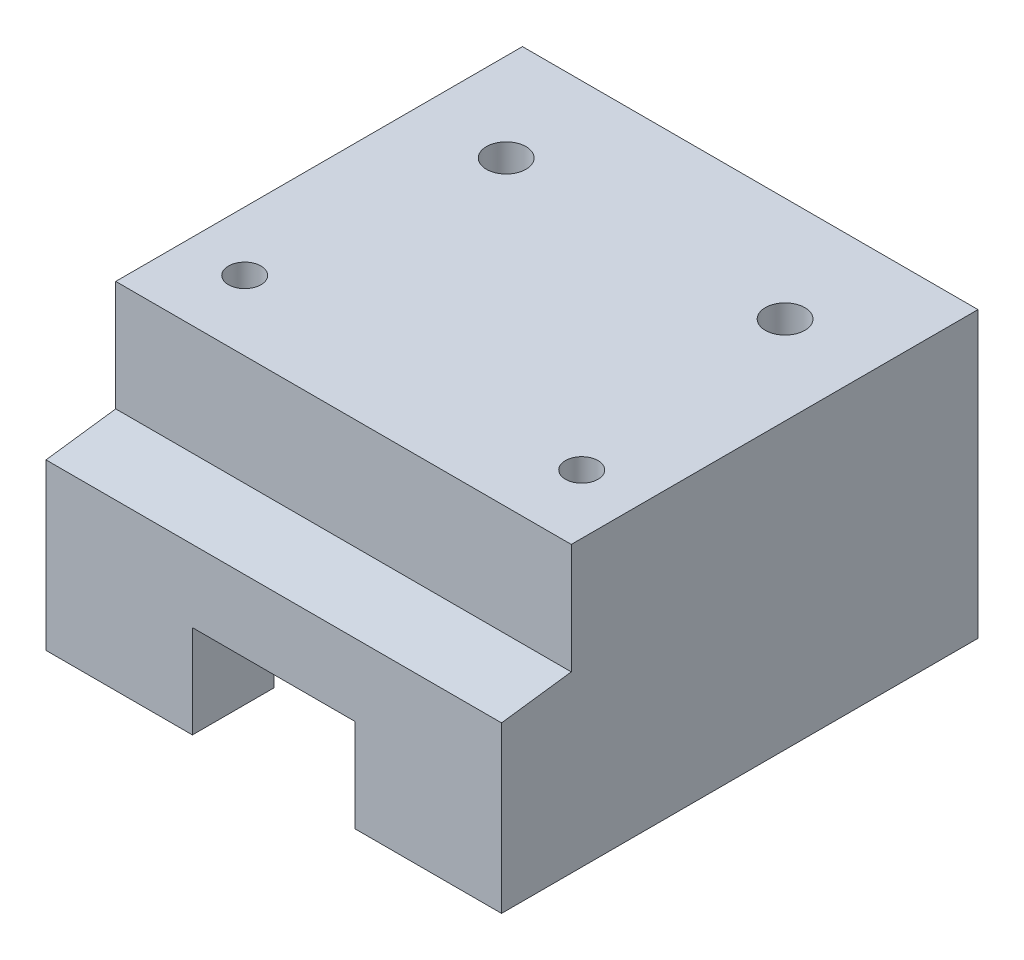
ISO-10303-21;
HEADER;
FILE_DESCRIPTION(('STEP AP214'),'2;1');
FILE_NAME('part.step','',(''),(''),'','','');
FILE_SCHEMA(('AUTOMOTIVE_DESIGN { 1 0 10303 214 1 1 1 1 }'));
ENDSEC;
DATA;
#1=APPLICATION_CONTEXT('core data for automotive mechanical design processes');
#2=APPLICATION_PROTOCOL_DEFINITION('international standard','automotive_design',2000,#1);
#3=PRODUCT_CONTEXT('',#1,'mechanical');
#4=PRODUCT('Part','Part','',(#3));
#5=PRODUCT_RELATED_PRODUCT_CATEGORY('part','',(#4));
#6=PRODUCT_DEFINITION_FORMATION('','',#4);
#7=PRODUCT_DEFINITION_CONTEXT('part definition',#1,'design');
#8=PRODUCT_DEFINITION('design','',#6,#7);
#9=PRODUCT_DEFINITION_SHAPE('','',#8);
#10=(LENGTH_UNIT() NAMED_UNIT(*) SI_UNIT(.MILLI.,.METRE.));
#11=(NAMED_UNIT(*) PLANE_ANGLE_UNIT() SI_UNIT($,.RADIAN.));
#12=(NAMED_UNIT(*) SI_UNIT($,.STERADIAN.) SOLID_ANGLE_UNIT());
#13=UNCERTAINTY_MEASURE_WITH_UNIT(LENGTH_MEASURE(1.E-05),#10,'distance_accuracy_value','');
#14=(GEOMETRIC_REPRESENTATION_CONTEXT(3) GLOBAL_UNCERTAINTY_ASSIGNED_CONTEXT((#13)) GLOBAL_UNIT_ASSIGNED_CONTEXT((#10,
#11,#12)) REPRESENTATION_CONTEXT('',''));
#15=CARTESIAN_POINT('',(0.,0.,0.));
#16=DIRECTION('',(0.,0.,1.));
#17=DIRECTION('',(1.,0.,0.));
#18=AXIS2_PLACEMENT_3D('',#15,#16,#17);
#19=CARTESIAN_POINT('',(0.,3.,0.));
#20=DIRECTION('',(0.,1.,0.));
#21=DIRECTION('',(-1.,0.,0.));
#22=AXIS2_PLACEMENT_3D('',#19,#20,#21);
#23=PLANE('',#22);
#24=DIRECTION('',(0.,0.,-1.));
#25=VECTOR('',#24,1.);
#26=CARTESIAN_POINT('',(-7.,3.,6.));
#27=LINE('',#26,#25);
#28=CARTESIAN_POINT('',(-7.,3.,6.));
#29=VERTEX_POINT('',#28);
#30=CARTESIAN_POINT('',(-7.,3.,-0.999999999999999));
#31=VERTEX_POINT('',#30);
#32=EDGE_CURVE('E306',#29,#31,#27,.T.);
#33=ORIENTED_EDGE('',*,*,#32,.T.);
#34=DIRECTION('',(1.,0.,0.));
#35=VECTOR('',#34,1.);
#36=CARTESIAN_POINT('',(0.,3.,-0.999999999999998));
#37=LINE('',#36,#35);
#38=CARTESIAN_POINT('',(7.,3.,-0.999999999999997));
#39=VERTEX_POINT('',#38);
#40=EDGE_CURVE('E372',#31,#39,#37,.T.);
#41=ORIENTED_EDGE('',*,*,#40,.T.);
#42=DIRECTION('',(0.,0.,1.));
#43=VECTOR('',#42,1.);
#44=CARTESIAN_POINT('',(7.00000000000001,3.,6.));
#45=LINE('',#44,#43);
#46=CARTESIAN_POINT('',(7.00000000000001,3.,6.));
#47=VERTEX_POINT('',#46);
#48=EDGE_CURVE('E317',#39,#47,#45,.T.);
#49=ORIENTED_EDGE('',*,*,#48,.T.);
#50=DIRECTION('',(-1.,0.,0.));
#51=VECTOR('',#50,1.);
#52=CARTESIAN_POINT('',(-7.,3.,6.));
#53=LINE('',#52,#51);
#54=EDGE_CURVE('E303',#47,#29,#53,.T.);
#55=ORIENTED_EDGE('',*,*,#54,.T.);
#56=EDGE_LOOP('',(#33,#41,#49,#55));
#57=FACE_BOUND('',#56,.T.);
#58=ADVANCED_FACE('F35',(#57),#23,.F.);
#59=CARTESIAN_POINT('',(0.,0.,6.));
#60=DIRECTION('',(0.,0.,1.));
#61=DIRECTION('',(1.,0.,0.));
#62=AXIS2_PLACEMENT_3D('',#59,#60,#61);
#63=PLANE('',#62);
#64=DIRECTION('',(0.,1.,0.));
#65=VECTOR('',#64,1.);
#66=CARTESIAN_POINT('',(19.6,-46.0019511730844,6.));
#67=LINE('',#66,#65);
#68=CARTESIAN_POINT('',(19.6,-5.,6.));
#69=VERTEX_POINT('',#68);
#70=CARTESIAN_POINT('',(19.6,9.2,6.));
#71=VERTEX_POINT('',#70);
#72=EDGE_CURVE('E193',#69,#71,#67,.T.);
#73=ORIENTED_EDGE('',*,*,#72,.T.);
#74=DIRECTION('',(-1.,0.,0.));
#75=VECTOR('',#74,1.);
#76=CARTESIAN_POINT('',(-20.,9.2,6.));
#77=LINE('',#76,#75);
#78=CARTESIAN_POINT('',(-19.6,9.2,6.));
#79=VERTEX_POINT('',#78);
#80=EDGE_CURVE('E57',#71,#79,#77,.T.);
#81=ORIENTED_EDGE('',*,*,#80,.T.);
#82=DIRECTION('',(0.,1.,0.));
#83=VECTOR('',#82,1.);
#84=CARTESIAN_POINT('',(-19.6,-46.0019511730844,6.));
#85=LINE('',#84,#83);
#86=CARTESIAN_POINT('',(-19.6,-5.,6.));
#87=VERTEX_POINT('',#86);
#88=EDGE_CURVE('E382',#87,#79,#85,.T.);
#89=ORIENTED_EDGE('',*,*,#88,.F.);
#90=DIRECTION('',(-1.,0.,0.));
#91=VECTOR('',#90,1.);
#92=CARTESIAN_POINT('',(-20.,-5.,6.));
#93=LINE('',#92,#91);
#94=CARTESIAN_POINT('',(-7.,-5.,6.));
#95=VERTEX_POINT('',#94);
#96=EDGE_CURVE('E241',#95,#87,#93,.T.);
#97=ORIENTED_EDGE('',*,*,#96,.F.);
#98=DIRECTION('',(0.,-1.,0.));
#99=VECTOR('',#98,1.);
#100=CARTESIAN_POINT('',(-7.,3.,6.));
#101=LINE('',#100,#99);
#102=EDGE_CURVE('E320',#29,#95,#101,.T.);
#103=ORIENTED_EDGE('',*,*,#102,.F.);
#104=ORIENTED_EDGE('',*,*,#54,.F.);
#105=DIRECTION('',(0.,-1.,0.));
#106=VECTOR('',#105,1.);
#107=CARTESIAN_POINT('',(7.00000000000001,3.,6.));
#108=LINE('',#107,#106);
#109=CARTESIAN_POINT('',(7.00000000000001,-5.,6.));
#110=VERTEX_POINT('',#109);
#111=EDGE_CURVE('E321',#47,#110,#108,.T.);
#112=ORIENTED_EDGE('',*,*,#111,.T.);
#113=EDGE_CURVE('E242',#69,#110,#93,.T.);
#114=ORIENTED_EDGE('',*,*,#113,.F.);
#115=EDGE_LOOP('',(#73,#81,#89,#97,#103,#104,#112,#114));
#116=FACE_BOUND('',#115,.T.);
#117=ADVANCED_FACE('F397',(#116),#63,.T.);
#118=CARTESIAN_POINT('',(0.,0.,0.));
#119=DIRECTION('',(0.,0.,1.));
#120=DIRECTION('',(1.,0.,0.));
#121=AXIS2_PLACEMENT_3D('',#118,#119,#120);
#122=PLANE('',#121);
#123=DIRECTION('',(0.,-1.,0.));
#124=VECTOR('',#123,1.);
#125=CARTESIAN_POINT('',(19.6,0.,0.));
#126=LINE('',#125,#124);
#127=CARTESIAN_POINT('',(19.6,19.5,0.));
#128=VERTEX_POINT('',#127);
#129=CARTESIAN_POINT('',(19.6,10.,0.));
#130=VERTEX_POINT('',#129);
#131=EDGE_CURVE('E49',#128,#130,#126,.T.);
#132=ORIENTED_EDGE('',*,*,#131,.F.);
#133=DIRECTION('',(1.,0.,0.));
#134=VECTOR('',#133,1.);
#135=CARTESIAN_POINT('',(-20.,19.5,0.));
#136=LINE('',#135,#134);
#137=CARTESIAN_POINT('',(-19.6,19.5,0.));
#138=VERTEX_POINT('',#137);
#139=EDGE_CURVE('E203',#138,#128,#136,.T.);
#140=ORIENTED_EDGE('',*,*,#139,.F.);
#141=DIRECTION('',(0.,1.,0.));
#142=VECTOR('',#141,1.);
#143=CARTESIAN_POINT('',(-19.6,0.,0.));
#144=LINE('',#143,#142);
#145=CARTESIAN_POINT('',(-19.6,9.99999999999998,0.));
#146=VERTEX_POINT('',#145);
#147=EDGE_CURVE('E214',#146,#138,#144,.T.);
#148=ORIENTED_EDGE('',*,*,#147,.F.);
#149=DIRECTION('',(-1.,0.,0.));
#150=VECTOR('',#149,1.);
#151=CARTESIAN_POINT('',(20.,10.,0.));
#152=LINE('',#151,#150);
#153=EDGE_CURVE('E324',#130,#146,#152,.T.);
#154=ORIENTED_EDGE('',*,*,#153,.F.);
#155=EDGE_LOOP('',(#132,#140,#148,#154));
#156=FACE_BOUND('',#155,.T.);
#157=ADVANCED_FACE('F386',(#156),#122,.T.);
#158=CARTESIAN_POINT('',(0.,0.,-35.));
#159=DIRECTION('',(0.,0.,1.));
#160=DIRECTION('',(1.,0.,0.));
#161=AXIS2_PLACEMENT_3D('',#158,#159,#160);
#162=PLANE('',#161);
#163=DIRECTION('',(-1.,0.,0.));
#164=VECTOR('',#163,1.);
#165=CARTESIAN_POINT('',(-20.,19.5,-35.));
#166=LINE('',#165,#164);
#167=CARTESIAN_POINT('',(19.6,19.5,-35.));
#168=VERTEX_POINT('',#167);
#169=CARTESIAN_POINT('',(-19.6,19.5,-35.));
#170=VERTEX_POINT('',#169);
#171=EDGE_CURVE('E200',#168,#170,#166,.T.);
#172=ORIENTED_EDGE('',*,*,#171,.F.);
#173=DIRECTION('',(0.,1.,0.));
#174=VECTOR('',#173,1.);
#175=CARTESIAN_POINT('',(19.6,-46.0019511730844,-35.));
#176=LINE('',#175,#174);
#177=CARTESIAN_POINT('',(19.6,-5.,-35.));
#178=VERTEX_POINT('',#177);
#179=EDGE_CURVE('E183',#178,#168,#176,.T.);
#180=ORIENTED_EDGE('',*,*,#179,.F.);
#181=DIRECTION('',(1.,0.,0.));
#182=VECTOR('',#181,1.);
#183=CARTESIAN_POINT('',(-20.,-5.,-35.));
#184=LINE('',#183,#182);
#185=CARTESIAN_POINT('',(4.50000000000001,-5.,-35.));
#186=VERTEX_POINT('',#185);
#187=EDGE_CURVE('E238',#186,#178,#184,.T.);
#188=ORIENTED_EDGE('',*,*,#187,.F.);
#189=DIRECTION('',(0.,-1.,0.));
#190=VECTOR('',#189,1.);
#191=CARTESIAN_POINT('',(4.5,3.,-35.));
#192=LINE('',#191,#190);
#193=CARTESIAN_POINT('',(4.5,3.,-35.));
#194=VERTEX_POINT('',#193);
#195=EDGE_CURVE('E343',#194,#186,#192,.T.);
#196=ORIENTED_EDGE('',*,*,#195,.F.);
#197=DIRECTION('',(1.,0.,0.));
#198=VECTOR('',#197,1.);
#199=CARTESIAN_POINT('',(4.5,3.,-35.));
#200=LINE('',#199,#198);
#201=CARTESIAN_POINT('',(-4.5,3.,-35.));
#202=VERTEX_POINT('',#201);
#203=EDGE_CURVE('E311',#202,#194,#200,.T.);
#204=ORIENTED_EDGE('',*,*,#203,.F.);
#205=DIRECTION('',(0.,-1.,0.));
#206=VECTOR('',#205,1.);
#207=CARTESIAN_POINT('',(-4.5,3.,-35.));
#208=LINE('',#207,#206);
#209=CARTESIAN_POINT('',(-4.49999999999999,-5.,-35.));
#210=VERTEX_POINT('',#209);
#211=EDGE_CURVE('E346',#202,#210,#208,.T.);
#212=ORIENTED_EDGE('',*,*,#211,.T.);
#213=CARTESIAN_POINT('',(-19.6,-5.,-35.));
#214=VERTEX_POINT('',#213);
#215=EDGE_CURVE('E239',#214,#210,#184,.T.);
#216=ORIENTED_EDGE('',*,*,#215,.F.);
#217=DIRECTION('',(0.,1.,0.));
#218=VECTOR('',#217,1.);
#219=CARTESIAN_POINT('',(-19.6,-46.0019511730844,-35.));
#220=LINE('',#219,#218);
#221=EDGE_CURVE('E208',#214,#170,#220,.T.);
#222=ORIENTED_EDGE('',*,*,#221,.T.);
#223=EDGE_LOOP('',(#172,#180,#188,#196,#204,#212,#216,#222));
#224=FACE_BOUND('',#223,.T.);
#225=ADVANCED_FACE('F206',(#224),#162,.F.);
#226=CARTESIAN_POINT('',(7.00000000000001,3.,6.));
#227=DIRECTION('',(1.,0.,0.));
#228=DIRECTION('',(0.,0.,-1.));
#229=AXIS2_PLACEMENT_3D('',#226,#227,#228);
#230=PLANE('',#229);
#231=DIRECTION('',(0.,-1.,0.));
#232=VECTOR('',#231,1.);
#233=CARTESIAN_POINT('',(7.,3.,-0.999999999999997));
#234=LINE('',#233,#232);
#235=CARTESIAN_POINT('',(7.,-5.,-0.999999999999997));
#236=VERTEX_POINT('',#235);
#237=EDGE_CURVE('E325',#39,#236,#234,.T.);
#238=ORIENTED_EDGE('',*,*,#237,.T.);
#239=DIRECTION('',(0.,0.,1.));
#240=VECTOR('',#239,1.);
#241=CARTESIAN_POINT('',(7.00000000000001,-5.,6.));
#242=LINE('',#241,#240);
#243=EDGE_CURVE('E276',#236,#110,#242,.T.);
#244=ORIENTED_EDGE('',*,*,#243,.T.);
#245=ORIENTED_EDGE('',*,*,#111,.F.);
#246=ORIENTED_EDGE('',*,*,#48,.F.);
#247=EDGE_LOOP('',(#238,#244,#245,#246));
#248=FACE_BOUND('',#247,.T.);
#249=ADVANCED_FACE('F475',(#248),#230,.F.);
#250=CARTESIAN_POINT('',(7.,3.,-0.999999999999997));
#251=DIRECTION('',(0.,0.,1.));
#252=DIRECTION('',(1.,0.,0.));
#253=AXIS2_PLACEMENT_3D('',#250,#251,#252);
#254=PLANE('',#253);
#255=DIRECTION('',(0.,-1.,0.));
#256=VECTOR('',#255,1.);
#257=CARTESIAN_POINT('',(9.,3.,-0.999999999999997));
#258=LINE('',#257,#256);
#259=CARTESIAN_POINT('',(9.,5.,-0.999999999999997));
#260=VERTEX_POINT('',#259);
#261=CARTESIAN_POINT('',(9.,-5.,-0.999999999999997));
#262=VERTEX_POINT('',#261);
#263=EDGE_CURVE('E328',#260,#262,#258,.T.);
#264=ORIENTED_EDGE('',*,*,#263,.T.);
#265=DIRECTION('',(-1.,0.,0.));
#266=VECTOR('',#265,1.);
#267=CARTESIAN_POINT('',(7.,-5.,-0.999999999999997));
#268=LINE('',#267,#266);
#269=EDGE_CURVE('E248',#262,#236,#268,.T.);
#270=ORIENTED_EDGE('',*,*,#269,.T.);
#271=ORIENTED_EDGE('',*,*,#237,.F.);
#272=ORIENTED_EDGE('',*,*,#40,.F.);
#273=DIRECTION('',(0.,-1.,0.));
#274=VECTOR('',#273,1.);
#275=CARTESIAN_POINT('',(-7.,3.,-0.999999999999999));
#276=LINE('',#275,#274);
#277=CARTESIAN_POINT('',(-7.,-5.,-0.999999999999999));
#278=VERTEX_POINT('',#277);
#279=EDGE_CURVE('E364',#31,#278,#276,.T.);
#280=ORIENTED_EDGE('',*,*,#279,.T.);
#281=CARTESIAN_POINT('',(-9.,-5.,-0.999999999999999));
#282=VERTEX_POINT('',#281);
#283=EDGE_CURVE('E244',#278,#282,#268,.T.);
#284=ORIENTED_EDGE('',*,*,#283,.T.);
#285=DIRECTION('',(0.,-1.,0.));
#286=VECTOR('',#285,1.);
#287=CARTESIAN_POINT('',(-9.,3.,-0.999999999999999));
#288=LINE('',#287,#286);
#289=CARTESIAN_POINT('',(-9.,5.,-0.999999999999999));
#290=VERTEX_POINT('',#289);
#291=EDGE_CURVE('E361',#290,#282,#288,.T.);
#292=ORIENTED_EDGE('',*,*,#291,.F.);
#293=DIRECTION('',(-1.,0.,0.));
#294=VECTOR('',#293,1.);
#295=CARTESIAN_POINT('',(-9.,5.,-0.999999999999999));
#296=LINE('',#295,#294);
#297=EDGE_CURVE('E300',#260,#290,#296,.T.);
#298=ORIENTED_EDGE('',*,*,#297,.F.);
#299=EDGE_LOOP('',(#264,#270,#271,#272,#280,#284,#292,#298));
#300=FACE_BOUND('',#299,.T.);
#301=ADVANCED_FACE('F465',(#300),#254,.F.);
#302=CARTESIAN_POINT('',(9.,3.,-0.999999999999997));
#303=DIRECTION('',(1.,0.,0.));
#304=DIRECTION('',(0.,1.,0.));
#305=AXIS2_PLACEMENT_3D('',#302,#303,#304);
#306=PLANE('',#305);
#307=DIRECTION('',(0.,-1.,0.));
#308=VECTOR('',#307,1.);
#309=CARTESIAN_POINT('',(9.,3.,-23.));
#310=LINE('',#309,#308);
#311=CARTESIAN_POINT('',(9.,5.,-23.));
#312=VERTEX_POINT('',#311);
#313=CARTESIAN_POINT('',(9.00000000000001,-5.,-23.));
#314=VERTEX_POINT('',#313);
#315=EDGE_CURVE('E331',#312,#314,#310,.T.);
#316=ORIENTED_EDGE('',*,*,#315,.T.);
#317=DIRECTION('',(0.,0.,1.));
#318=VECTOR('',#317,1.);
#319=CARTESIAN_POINT('',(9.,-5.,-0.999999999999997));
#320=LINE('',#319,#318);
#321=EDGE_CURVE('E273',#314,#262,#320,.T.);
#322=ORIENTED_EDGE('',*,*,#321,.T.);
#323=ORIENTED_EDGE('',*,*,#263,.F.);
#324=DIRECTION('',(0.,0.,1.));
#325=VECTOR('',#324,1.);
#326=CARTESIAN_POINT('',(9.,5.,-0.999999999999997));
#327=LINE('',#326,#325);
#328=EDGE_CURVE('E297',#312,#260,#327,.T.);
#329=ORIENTED_EDGE('',*,*,#328,.F.);
#330=EDGE_LOOP('',(#316,#322,#323,#329));
#331=FACE_BOUND('',#330,.T.);
#332=ADVANCED_FACE('F478',(#331),#306,.F.);
#333=CARTESIAN_POINT('',(9.,3.,-23.));
#334=DIRECTION('',(0.768221279597377,0.,-0.640184399664479));
#335=DIRECTION('',(-0.640184399664479,0.,-0.768221279597377));
#336=AXIS2_PLACEMENT_3D('',#333,#334,#335);
#337=PLANE('',#336);
#338=DIRECTION('',(0.,-1.,0.));
#339=VECTOR('',#338,1.);
#340=CARTESIAN_POINT('',(6.5,3.,-26.));
#341=LINE('',#340,#339);
#342=CARTESIAN_POINT('',(6.5,5.,-26.));
#343=VERTEX_POINT('',#342);
#344=CARTESIAN_POINT('',(6.50000000000001,-5.,-26.));
#345=VERTEX_POINT('',#344);
#346=EDGE_CURVE('E334',#343,#345,#341,.T.);
#347=ORIENTED_EDGE('',*,*,#346,.T.);
#348=DIRECTION('',(0.640184399664479,0.,0.768221279597377));
#349=VECTOR('',#348,1.);
#350=CARTESIAN_POINT('',(9.,-5.,-23.));
#351=LINE('',#350,#349);
#352=EDGE_CURVE('E270',#345,#314,#351,.T.);
#353=ORIENTED_EDGE('',*,*,#352,.T.);
#354=ORIENTED_EDGE('',*,*,#315,.F.);
#355=DIRECTION('',(0.640184399664479,0.,0.768221279597377));
#356=VECTOR('',#355,1.);
#357=CARTESIAN_POINT('',(9.,5.,-23.));
#358=LINE('',#357,#356);
#359=EDGE_CURVE('E294',#343,#312,#358,.T.);
#360=ORIENTED_EDGE('',*,*,#359,.F.);
#361=EDGE_LOOP('',(#347,#353,#354,#360));
#362=FACE_BOUND('',#361,.T.);
#363=ADVANCED_FACE('F451',(#362),#337,.F.);
#364=CARTESIAN_POINT('',(6.5,3.,-26.));
#365=DIRECTION('',(1.,0.,0.));
#366=DIRECTION('',(0.,1.,0.));
#367=AXIS2_PLACEMENT_3D('',#364,#365,#366);
#368=PLANE('',#367);
#369=DIRECTION('',(0.,-1.,0.));
#370=VECTOR('',#369,1.);
#371=CARTESIAN_POINT('',(6.5,3.,-33.));
#372=LINE('',#371,#370);
#373=CARTESIAN_POINT('',(6.5,5.,-33.));
#374=VERTEX_POINT('',#373);
#375=CARTESIAN_POINT('',(6.50000000000001,-5.,-33.));
#376=VERTEX_POINT('',#375);
#377=EDGE_CURVE('E337',#374,#376,#372,.T.);
#378=ORIENTED_EDGE('',*,*,#377,.T.);
#379=DIRECTION('',(0.,0.,1.));
#380=VECTOR('',#379,1.);
#381=CARTESIAN_POINT('',(6.50000000000001,-5.,-26.));
#382=LINE('',#381,#380);
#383=EDGE_CURVE('E267',#376,#345,#382,.T.);
#384=ORIENTED_EDGE('',*,*,#383,.T.);
#385=ORIENTED_EDGE('',*,*,#346,.F.);
#386=DIRECTION('',(0.,0.,1.));
#387=VECTOR('',#386,1.);
#388=CARTESIAN_POINT('',(6.5,5.,-26.));
#389=LINE('',#388,#387);
#390=EDGE_CURVE('E291',#374,#343,#389,.T.);
#391=ORIENTED_EDGE('',*,*,#390,.F.);
#392=EDGE_LOOP('',(#378,#384,#385,#391));
#393=FACE_BOUND('',#392,.T.);
#394=ADVANCED_FACE('F447',(#393),#368,.F.);
#395=CARTESIAN_POINT('',(6.5,3.,-33.));
#396=DIRECTION('',(0.,0.,-1.));
#397=DIRECTION('',(-1.,0.,0.));
#398=AXIS2_PLACEMENT_3D('',#395,#396,#397);
#399=PLANE('',#398);
#400=DIRECTION('',(0.,-1.,0.));
#401=VECTOR('',#400,1.);
#402=CARTESIAN_POINT('',(-6.5,3.,-33.));
#403=LINE('',#402,#401);
#404=CARTESIAN_POINT('',(-6.5,5.,-33.));
#405=VERTEX_POINT('',#404);
#406=CARTESIAN_POINT('',(-6.49999999999999,-5.,-33.));
#407=VERTEX_POINT('',#406);
#408=EDGE_CURVE('E352',#405,#407,#403,.T.);
#409=ORIENTED_EDGE('',*,*,#408,.T.);
#410=DIRECTION('',(1.,0.,0.));
#411=VECTOR('',#410,1.);
#412=CARTESIAN_POINT('',(6.50000000000001,-5.,-33.));
#413=LINE('',#412,#411);
#414=CARTESIAN_POINT('',(-4.5,-5.,-33.));
#415=VERTEX_POINT('',#414);
#416=EDGE_CURVE('E257',#407,#415,#413,.T.);
#417=ORIENTED_EDGE('',*,*,#416,.T.);
#418=DIRECTION('',(0.,-1.,0.));
#419=VECTOR('',#418,1.);
#420=CARTESIAN_POINT('',(-4.5,3.,-33.));
#421=LINE('',#420,#419);
#422=CARTESIAN_POINT('',(-4.49999999999999,3.,-33.));
#423=VERTEX_POINT('',#422);
#424=EDGE_CURVE('E349',#423,#415,#421,.T.);
#425=ORIENTED_EDGE('',*,*,#424,.F.);
#426=DIRECTION('',(-1.,0.,0.));
#427=VECTOR('',#426,1.);
#428=CARTESIAN_POINT('',(0.,3.,-33.));
#429=LINE('',#428,#427);
#430=CARTESIAN_POINT('',(4.50000000000001,3.,-33.));
#431=VERTEX_POINT('',#430);
#432=EDGE_CURVE('E370',#431,#423,#429,.T.);
#433=ORIENTED_EDGE('',*,*,#432,.F.);
#434=DIRECTION('',(0.,-1.,0.));
#435=VECTOR('',#434,1.);
#436=CARTESIAN_POINT('',(4.5,3.,-33.));
#437=LINE('',#436,#435);
#438=CARTESIAN_POINT('',(4.50000000000001,-5.,-33.));
#439=VERTEX_POINT('',#438);
#440=EDGE_CURVE('E340',#431,#439,#437,.T.);
#441=ORIENTED_EDGE('',*,*,#440,.T.);
#442=EDGE_CURVE('E261',#439,#376,#413,.T.);
#443=ORIENTED_EDGE('',*,*,#442,.T.);
#444=ORIENTED_EDGE('',*,*,#377,.F.);
#445=DIRECTION('',(1.,0.,0.));
#446=VECTOR('',#445,1.);
#447=CARTESIAN_POINT('',(6.5,5.,-33.));
#448=LINE('',#447,#446);
#449=EDGE_CURVE('E288',#405,#374,#448,.T.);
#450=ORIENTED_EDGE('',*,*,#449,.F.);
#451=EDGE_LOOP('',(#409,#417,#425,#433,#441,#443,#444,#450));
#452=FACE_BOUND('',#451,.T.);
#453=ADVANCED_FACE('F439',(#452),#399,.F.);
#454=CARTESIAN_POINT('',(4.5,3.,-33.));
#455=DIRECTION('',(1.,0.,0.));
#456=DIRECTION('',(0.,1.,0.));
#457=AXIS2_PLACEMENT_3D('',#454,#455,#456);
#458=PLANE('',#457);
#459=ORIENTED_EDGE('',*,*,#195,.T.);
#460=DIRECTION('',(0.,0.,1.));
#461=VECTOR('',#460,1.);
#462=CARTESIAN_POINT('',(4.50000000000001,-5.,-33.));
#463=LINE('',#462,#461);
#464=EDGE_CURVE('E264',#186,#439,#463,.T.);
#465=ORIENTED_EDGE('',*,*,#464,.T.);
#466=ORIENTED_EDGE('',*,*,#440,.F.);
#467=DIRECTION('',(0.,0.,1.));
#468=VECTOR('',#467,1.);
#469=CARTESIAN_POINT('',(4.5,3.,-33.));
#470=LINE('',#469,#468);
#471=EDGE_CURVE('E314',#194,#431,#470,.T.);
#472=ORIENTED_EDGE('',*,*,#471,.F.);
#473=EDGE_LOOP('',(#459,#465,#466,#472));
#474=FACE_BOUND('',#473,.T.);
#475=ADVANCED_FACE('F436',(#474),#458,.F.);
#476=CARTESIAN_POINT('',(-4.5,3.,-33.));
#477=DIRECTION('',(-1.,0.,0.));
#478=DIRECTION('',(0.,-1.,0.));
#479=AXIS2_PLACEMENT_3D('',#476,#477,#478);
#480=PLANE('',#479);
#481=ORIENTED_EDGE('',*,*,#424,.T.);
#482=DIRECTION('',(0.,0.,-1.));
#483=VECTOR('',#482,1.);
#484=CARTESIAN_POINT('',(-4.49999999999999,-5.,-33.));
#485=LINE('',#484,#483);
#486=EDGE_CURVE('E260',#415,#210,#485,.T.);
#487=ORIENTED_EDGE('',*,*,#486,.T.);
#488=ORIENTED_EDGE('',*,*,#211,.F.);
#489=DIRECTION('',(0.,0.,-1.));
#490=VECTOR('',#489,1.);
#491=CARTESIAN_POINT('',(-4.5,3.,-33.));
#492=LINE('',#491,#490);
#493=EDGE_CURVE('E309',#423,#202,#492,.T.);
#494=ORIENTED_EDGE('',*,*,#493,.F.);
#495=EDGE_LOOP('',(#481,#487,#488,#494));
#496=FACE_BOUND('',#495,.T.);
#497=ADVANCED_FACE('F443',(#496),#480,.F.);
#498=CARTESIAN_POINT('',(-6.5,3.,-26.));
#499=DIRECTION('',(-1.,0.,0.));
#500=DIRECTION('',(0.,-1.,0.));
#501=AXIS2_PLACEMENT_3D('',#498,#499,#500);
#502=PLANE('',#501);
#503=DIRECTION('',(0.,-1.,0.));
#504=VECTOR('',#503,1.);
#505=CARTESIAN_POINT('',(-6.5,3.,-26.));
#506=LINE('',#505,#504);
#507=CARTESIAN_POINT('',(-6.5,5.,-26.));
#508=VERTEX_POINT('',#507);
#509=CARTESIAN_POINT('',(-6.49999999999999,-5.,-26.));
#510=VERTEX_POINT('',#509);
#511=EDGE_CURVE('E355',#508,#510,#506,.T.);
#512=ORIENTED_EDGE('',*,*,#511,.T.);
#513=DIRECTION('',(0.,0.,-1.));
#514=VECTOR('',#513,1.);
#515=CARTESIAN_POINT('',(-6.49999999999999,-5.,-26.));
#516=LINE('',#515,#514);
#517=EDGE_CURVE('E254',#510,#407,#516,.T.);
#518=ORIENTED_EDGE('',*,*,#517,.T.);
#519=ORIENTED_EDGE('',*,*,#408,.F.);
#520=DIRECTION('',(0.,0.,-1.));
#521=VECTOR('',#520,1.);
#522=CARTESIAN_POINT('',(-6.5,5.,-33.));
#523=LINE('',#522,#521);
#524=EDGE_CURVE('E285',#508,#405,#523,.T.);
#525=ORIENTED_EDGE('',*,*,#524,.F.);
#526=EDGE_LOOP('',(#512,#518,#519,#525));
#527=FACE_BOUND('',#526,.T.);
#528=ADVANCED_FACE('F456',(#527),#502,.F.);
#529=CARTESIAN_POINT('',(-8.99999999999999,3.,-23.));
#530=DIRECTION('',(-0.768221279597376,0.,-0.640184399664479));
#531=DIRECTION('',(-0.640184399664479,0.,0.768221279597376));
#532=AXIS2_PLACEMENT_3D('',#529,#530,#531);
#533=PLANE('',#532);
#534=DIRECTION('',(0.,-1.,0.));
#535=VECTOR('',#534,1.);
#536=CARTESIAN_POINT('',(-8.99999999999999,3.,-23.));
#537=LINE('',#536,#535);
#538=CARTESIAN_POINT('',(-8.99999999999999,5.,-23.));
#539=VERTEX_POINT('',#538);
#540=CARTESIAN_POINT('',(-8.99999999999999,-5.,-23.));
#541=VERTEX_POINT('',#540);
#542=EDGE_CURVE('E358',#539,#541,#537,.T.);
#543=ORIENTED_EDGE('',*,*,#542,.T.);
#544=DIRECTION('',(0.640184399664479,0.,-0.768221279597376));
#545=VECTOR('',#544,1.);
#546=CARTESIAN_POINT('',(-8.99999999999999,-5.,-23.));
#547=LINE('',#546,#545);
#548=EDGE_CURVE('E251',#541,#510,#547,.T.);
#549=ORIENTED_EDGE('',*,*,#548,.T.);
#550=ORIENTED_EDGE('',*,*,#511,.F.);
#551=DIRECTION('',(0.640184399664479,0.,-0.768221279597377));
#552=VECTOR('',#551,1.);
#553=CARTESIAN_POINT('',(-6.5,5.,-26.));
#554=LINE('',#553,#552);
#555=EDGE_CURVE('E282',#539,#508,#554,.T.);
#556=ORIENTED_EDGE('',*,*,#555,.F.);
#557=EDGE_LOOP('',(#543,#549,#550,#556));
#558=FACE_BOUND('',#557,.T.);
#559=ADVANCED_FACE('F460',(#558),#533,.F.);
#560=CARTESIAN_POINT('',(-9.,3.,-0.999999999999999));
#561=DIRECTION('',(-1.,0.,0.));
#562=DIRECTION('',(0.,0.,1.));
#563=AXIS2_PLACEMENT_3D('',#560,#561,#562);
#564=PLANE('',#563);
#565=ORIENTED_EDGE('',*,*,#291,.T.);
#566=DIRECTION('',(0.,0.,-1.));
#567=VECTOR('',#566,1.);
#568=CARTESIAN_POINT('',(-9.,-5.,-0.999999999999999));
#569=LINE('',#568,#567);
#570=EDGE_CURVE('E247',#282,#541,#569,.T.);
#571=ORIENTED_EDGE('',*,*,#570,.T.);
#572=ORIENTED_EDGE('',*,*,#542,.F.);
#573=DIRECTION('',(0.,0.,-1.));
#574=VECTOR('',#573,1.);
#575=CARTESIAN_POINT('',(-8.99999999999999,5.,-23.));
#576=LINE('',#575,#574);
#577=EDGE_CURVE('E279',#290,#539,#576,.T.);
#578=ORIENTED_EDGE('',*,*,#577,.F.);
#579=EDGE_LOOP('',(#565,#571,#572,#578));
#580=FACE_BOUND('',#579,.T.);
#581=ADVANCED_FACE('F428',(#580),#564,.F.);
#582=CARTESIAN_POINT('',(-7.,3.,6.));
#583=DIRECTION('',(-1.,0.,0.));
#584=DIRECTION('',(0.,-1.,0.));
#585=AXIS2_PLACEMENT_3D('',#582,#583,#584);
#586=PLANE('',#585);
#587=ORIENTED_EDGE('',*,*,#102,.T.);
#588=DIRECTION('',(0.,0.,-1.));
#589=VECTOR('',#588,1.);
#590=CARTESIAN_POINT('',(-7.,-5.,6.));
#591=LINE('',#590,#589);
#592=EDGE_CURVE('E374',#95,#278,#591,.T.);
#593=ORIENTED_EDGE('',*,*,#592,.T.);
#594=ORIENTED_EDGE('',*,*,#279,.F.);
#595=ORIENTED_EDGE('',*,*,#32,.F.);
#596=EDGE_LOOP('',(#587,#593,#594,#595));
#597=FACE_BOUND('',#596,.T.);
#598=ADVANCED_FACE('F420',(#597),#586,.F.);
#599=ORIENTED_EDGE('',*,*,#471,.T.);
#600=ORIENTED_EDGE('',*,*,#432,.T.);
#601=ORIENTED_EDGE('',*,*,#493,.T.);
#602=ORIENTED_EDGE('',*,*,#203,.T.);
#603=EDGE_LOOP('',(#599,#600,#601,#602));
#604=FACE_BOUND('',#603,.T.);
#605=ADVANCED_FACE('F411',(#604),#23,.F.);
#606=CARTESIAN_POINT('',(0.,5.,0.));
#607=DIRECTION('',(0.,1.,0.));
#608=DIRECTION('',(-1.,0.,0.));
#609=AXIS2_PLACEMENT_3D('',#606,#607,#608);
#610=PLANE('',#609);
#611=ORIENTED_EDGE('',*,*,#577,.T.);
#612=ORIENTED_EDGE('',*,*,#555,.T.);
#613=ORIENTED_EDGE('',*,*,#524,.T.);
#614=ORIENTED_EDGE('',*,*,#449,.T.);
#615=ORIENTED_EDGE('',*,*,#390,.T.);
#616=ORIENTED_EDGE('',*,*,#359,.T.);
#617=ORIENTED_EDGE('',*,*,#328,.T.);
#618=ORIENTED_EDGE('',*,*,#297,.T.);
#619=EDGE_LOOP('',(#611,#612,#613,#614,#615,#616,#617,#618));
#620=FACE_BOUND('',#619,.T.);
#621=ADVANCED_FACE('F419',(#620),#610,.F.);
#622=CARTESIAN_POINT('',(0.,-5.,0.));
#623=DIRECTION('',(0.,1.,0.));
#624=DIRECTION('',(-1.,0.,0.));
#625=AXIS2_PLACEMENT_3D('',#622,#623,#624);
#626=PLANE('',#625);
#627=CARTESIAN_POINT('',(-12.,-5.,-26.));
#628=DIRECTION('',(0.,-1.,0.));
#629=DIRECTION('',(-1.,0.,0.));
#630=AXIS2_PLACEMENT_3D('',#627,#628,#629);
#631=CIRCLE('',#630,1.7);
#632=CARTESIAN_POINT('',(-13.7,-5.,-26.));
#633=VERTEX_POINT('',#632);
#634=EDGE_CURVE('E231',#633,#633,#631,.T.);
#635=ORIENTED_EDGE('',*,*,#634,.F.);
#636=EDGE_LOOP('',(#635));
#637=FACE_BOUND('',#636,.T.);
#638=CARTESIAN_POINT('',(-14.5,-5.,-6.));
#639=DIRECTION('',(0.,-1.,0.));
#640=DIRECTION('',(-1.,0.,0.));
#641=AXIS2_PLACEMENT_3D('',#638,#639,#640);
#642=CIRCLE('',#641,1.4);
#643=CARTESIAN_POINT('',(-15.9,-5.,-6.));
#644=VERTEX_POINT('',#643);
#645=EDGE_CURVE('E226',#644,#644,#642,.T.);
#646=ORIENTED_EDGE('',*,*,#645,.F.);
#647=EDGE_LOOP('',(#646));
#648=FACE_BOUND('',#647,.T.);
#649=ORIENTED_EDGE('',*,*,#96,.T.);
#650=DIRECTION('',(0.,0.,1.));
#651=VECTOR('',#650,1.);
#652=CARTESIAN_POINT('',(-19.6,-5.,-35.));
#653=LINE('',#652,#651);
#654=EDGE_CURVE('E387',#214,#87,#653,.T.);
#655=ORIENTED_EDGE('',*,*,#654,.F.);
#656=ORIENTED_EDGE('',*,*,#215,.T.);
#657=ORIENTED_EDGE('',*,*,#486,.F.);
#658=ORIENTED_EDGE('',*,*,#416,.F.);
#659=ORIENTED_EDGE('',*,*,#517,.F.);
#660=ORIENTED_EDGE('',*,*,#548,.F.);
#661=ORIENTED_EDGE('',*,*,#570,.F.);
#662=ORIENTED_EDGE('',*,*,#283,.F.);
#663=ORIENTED_EDGE('',*,*,#592,.F.);
#664=EDGE_LOOP('',(#649,#655,#656,#657,#658,#659,#660,#661,#662,#663));
#665=FACE_BOUND('',#664,.T.);
#666=ADVANCED_FACE('F426',(#637,#648,#665),#626,.F.);
#667=CARTESIAN_POINT('',(14.5,-5.,-6.));
#668=DIRECTION('',(0.,-1.,0.));
#669=DIRECTION('',(1.,0.,0.));
#670=AXIS2_PLACEMENT_3D('',#667,#668,#669);
#671=CIRCLE('',#670,1.4);
#672=CARTESIAN_POINT('',(15.9,-5.,-6.));
#673=VERTEX_POINT('',#672);
#674=EDGE_CURVE('E227',#673,#673,#671,.T.);
#675=ORIENTED_EDGE('',*,*,#674,.F.);
#676=EDGE_LOOP('',(#675));
#677=FACE_BOUND('',#676,.T.);
#678=CARTESIAN_POINT('',(12.,-5.,-26.));
#679=DIRECTION('',(0.,-1.,0.));
#680=DIRECTION('',(1.,0.,0.));
#681=AXIS2_PLACEMENT_3D('',#678,#679,#680);
#682=CIRCLE('',#681,1.7);
#683=CARTESIAN_POINT('',(13.7,-5.,-26.));
#684=VERTEX_POINT('',#683);
#685=EDGE_CURVE('E230',#684,#684,#682,.T.);
#686=ORIENTED_EDGE('',*,*,#685,.F.);
#687=EDGE_LOOP('',(#686));
#688=FACE_BOUND('',#687,.T.);
#689=ORIENTED_EDGE('',*,*,#187,.T.);
#690=DIRECTION('',(0.,0.,-1.));
#691=VECTOR('',#690,1.);
#692=CARTESIAN_POINT('',(19.6,-5.,-35.));
#693=LINE('',#692,#691);
#694=EDGE_CURVE('E188',#69,#178,#693,.T.);
#695=ORIENTED_EDGE('',*,*,#694,.F.);
#696=ORIENTED_EDGE('',*,*,#113,.T.);
#697=ORIENTED_EDGE('',*,*,#243,.F.);
#698=ORIENTED_EDGE('',*,*,#269,.F.);
#699=ORIENTED_EDGE('',*,*,#321,.F.);
#700=ORIENTED_EDGE('',*,*,#352,.F.);
#701=ORIENTED_EDGE('',*,*,#383,.F.);
#702=ORIENTED_EDGE('',*,*,#442,.F.);
#703=ORIENTED_EDGE('',*,*,#464,.F.);
#704=EDGE_LOOP('',(#689,#695,#696,#697,#698,#699,#700,#701,#702,#703));
#705=FACE_BOUND('',#704,.T.);
#706=ADVANCED_FACE('F445',(#677,#688,#705),#626,.F.);
#707=CARTESIAN_POINT('',(12.,22.5,-26.));
#708=DIRECTION('',(0.,-1.,0.));
#709=DIRECTION('',(1.,0.,0.));
#710=AXIS2_PLACEMENT_3D('',#707,#708,#709);
#711=CYLINDRICAL_SURFACE('',#710,1.7);
#712=CARTESIAN_POINT('',(12.,19.5,-26.));
#713=DIRECTION('',(0.,-1.,0.));
#714=DIRECTION('',(0.,0.,-1.));
#715=AXIS2_PLACEMENT_3D('',#712,#713,#714);
#716=CIRCLE('',#715,1.7);
#717=CARTESIAN_POINT('',(12.,19.5,-27.7));
#718=VERTEX_POINT('',#717);
#719=EDGE_CURVE('E223',#718,#718,#716,.F.);
#720=ORIENTED_EDGE('',*,*,#719,.T.);
#721=EDGE_LOOP('',(#720));
#722=FACE_BOUND('',#721,.T.);
#723=ORIENTED_EDGE('',*,*,#685,.T.);
#724=EDGE_LOOP('',(#723));
#725=FACE_BOUND('',#724,.T.);
#726=ADVANCED_FACE('F526',(#722,#725),#711,.F.);
#727=CARTESIAN_POINT('',(14.5,22.5,-6.));
#728=DIRECTION('',(0.,-1.,0.));
#729=DIRECTION('',(1.,0.,0.));
#730=AXIS2_PLACEMENT_3D('',#727,#728,#729);
#731=CYLINDRICAL_SURFACE('',#730,1.4);
#732=CARTESIAN_POINT('',(14.5,19.5,-6.));
#733=DIRECTION('',(0.,-1.,0.));
#734=DIRECTION('',(0.,0.,-1.));
#735=AXIS2_PLACEMENT_3D('',#732,#733,#734);
#736=CIRCLE('',#735,1.4);
#737=CARTESIAN_POINT('',(14.5,19.5,-7.4));
#738=VERTEX_POINT('',#737);
#739=EDGE_CURVE('E220',#738,#738,#736,.F.);
#740=ORIENTED_EDGE('',*,*,#739,.T.);
#741=EDGE_LOOP('',(#740));
#742=FACE_BOUND('',#741,.T.);
#743=ORIENTED_EDGE('',*,*,#674,.T.);
#744=EDGE_LOOP('',(#743));
#745=FACE_BOUND('',#744,.T.);
#746=ADVANCED_FACE('F554',(#742,#745),#731,.F.);
#747=CARTESIAN_POINT('',(-14.5,22.5,-6.));
#748=DIRECTION('',(0.,-1.,0.));
#749=DIRECTION('',(1.,0.,0.));
#750=AXIS2_PLACEMENT_3D('',#747,#748,#749);
#751=CYLINDRICAL_SURFACE('',#750,1.4);
#752=CARTESIAN_POINT('',(-14.5,19.5,-6.));
#753=DIRECTION('',(0.,-1.,0.));
#754=DIRECTION('',(0.,0.,-1.));
#755=AXIS2_PLACEMENT_3D('',#752,#753,#754);
#756=CIRCLE('',#755,1.4);
#757=CARTESIAN_POINT('',(-14.5,19.5,-7.39999999999999));
#758=VERTEX_POINT('',#757);
#759=EDGE_CURVE('E212',#758,#758,#756,.F.);
#760=ORIENTED_EDGE('',*,*,#759,.T.);
#761=EDGE_LOOP('',(#760));
#762=FACE_BOUND('',#761,.T.);
#763=ORIENTED_EDGE('',*,*,#645,.T.);
#764=EDGE_LOOP('',(#763));
#765=FACE_BOUND('',#764,.T.);
#766=ADVANCED_FACE('F557',(#762,#765),#751,.F.);
#767=CARTESIAN_POINT('',(-12.,22.5,-26.));
#768=DIRECTION('',(0.,-1.,0.));
#769=DIRECTION('',(1.,0.,0.));
#770=AXIS2_PLACEMENT_3D('',#767,#768,#769);
#771=CYLINDRICAL_SURFACE('',#770,1.7);
#772=CARTESIAN_POINT('',(-12.,19.5,-26.));
#773=DIRECTION('',(0.,-1.,0.));
#774=DIRECTION('',(0.,0.,-1.));
#775=AXIS2_PLACEMENT_3D('',#772,#773,#774);
#776=CIRCLE('',#775,1.7);
#777=CARTESIAN_POINT('',(-12.,19.5,-27.7));
#778=VERTEX_POINT('',#777);
#779=EDGE_CURVE('E209',#778,#778,#776,.F.);
#780=ORIENTED_EDGE('',*,*,#779,.T.);
#781=EDGE_LOOP('',(#780));
#782=FACE_BOUND('',#781,.T.);
#783=ORIENTED_EDGE('',*,*,#634,.T.);
#784=EDGE_LOOP('',(#783));
#785=FACE_BOUND('',#784,.T.);
#786=ADVANCED_FACE('F405',(#782,#785),#771,.F.);
#787=CARTESIAN_POINT('',(-20.,19.5,-75.1123422402632));
#788=DIRECTION('',(0.,-1.,0.));
#789=DIRECTION('',(0.,0.,-1.));
#790=AXIS2_PLACEMENT_3D('',#787,#788,#789);
#791=PLANE('',#790);
#792=ORIENTED_EDGE('',*,*,#739,.F.);
#793=EDGE_LOOP('',(#792));
#794=FACE_BOUND('',#793,.T.);
#795=ORIENTED_EDGE('',*,*,#779,.F.);
#796=EDGE_LOOP('',(#795));
#797=FACE_BOUND('',#796,.T.);
#798=ORIENTED_EDGE('',*,*,#139,.T.);
#799=DIRECTION('',(0.,0.,1.));
#800=VECTOR('',#799,1.);
#801=CARTESIAN_POINT('',(19.6,19.5,-35.));
#802=LINE('',#801,#800);
#803=EDGE_CURVE('E186',#168,#128,#802,.T.);
#804=ORIENTED_EDGE('',*,*,#803,.F.);
#805=ORIENTED_EDGE('',*,*,#171,.T.);
#806=DIRECTION('',(0.,0.,-1.));
#807=VECTOR('',#806,1.);
#808=CARTESIAN_POINT('',(-19.6,19.5,-35.));
#809=LINE('',#808,#807);
#810=EDGE_CURVE('E391',#138,#170,#809,.T.);
#811=ORIENTED_EDGE('',*,*,#810,.F.);
#812=EDGE_LOOP('',(#798,#804,#805,#811));
#813=FACE_BOUND('',#812,.T.);
#814=ORIENTED_EDGE('',*,*,#759,.F.);
#815=EDGE_LOOP('',(#814));
#816=FACE_BOUND('',#815,.T.);
#817=ORIENTED_EDGE('',*,*,#719,.F.);
#818=EDGE_LOOP('',(#817));
#819=FACE_BOUND('',#818,.T.);
#820=ADVANCED_FACE('F197',(#794,#797,#813,#816,#819),#791,.F.);
#821=CARTESIAN_POINT('',(0.,9.2,6.));
#822=DIRECTION('',(0.,0.991227900682635,0.132163720091015));
#823=DIRECTION('',(1.,0.,0.));
#824=AXIS2_PLACEMENT_3D('',#821,#822,#823);
#825=PLANE('',#824);
#826=DIRECTION('',(0.,-0.132163720091015,0.991227900682635));
#827=VECTOR('',#826,1.);
#828=CARTESIAN_POINT('',(19.6,9.2,6.));
#829=LINE('',#828,#827);
#830=EDGE_CURVE('E11',#130,#71,#829,.T.);
#831=ORIENTED_EDGE('',*,*,#830,.F.);
#832=ORIENTED_EDGE('',*,*,#153,.T.);
#833=DIRECTION('',(0.,0.132163720091015,-0.991227900682635));
#834=VECTOR('',#833,1.);
#835=CARTESIAN_POINT('',(-19.6,9.2,6.));
#836=LINE('',#835,#834);
#837=EDGE_CURVE('E43',#79,#146,#836,.T.);
#838=ORIENTED_EDGE('',*,*,#837,.F.);
#839=ORIENTED_EDGE('',*,*,#80,.F.);
#840=EDGE_LOOP('',(#831,#832,#838,#839));
#841=FACE_BOUND('',#840,.T.);
#842=ADVANCED_FACE('F37',(#841),#825,.T.);
#843=CARTESIAN_POINT('',(-19.6,-46.0019511730844,-35.));
#844=DIRECTION('',(1.,0.,0.));
#845=DIRECTION('',(0.,0.,-1.));
#846=AXIS2_PLACEMENT_3D('',#843,#844,#845);
#847=PLANE('',#846);
#848=ORIENTED_EDGE('',*,*,#147,.T.);
#849=ORIENTED_EDGE('',*,*,#810,.T.);
#850=ORIENTED_EDGE('',*,*,#221,.F.);
#851=ORIENTED_EDGE('',*,*,#654,.T.);
#852=ORIENTED_EDGE('',*,*,#88,.T.);
#853=ORIENTED_EDGE('',*,*,#837,.T.);
#854=EDGE_LOOP('',(#848,#849,#850,#851,#852,#853));
#855=FACE_BOUND('',#854,.T.);
#856=ADVANCED_FACE('F381',(#855),#847,.F.);
#857=CARTESIAN_POINT('',(19.6,-46.0019511730844,-35.));
#858=DIRECTION('',(-1.,0.,0.));
#859=DIRECTION('',(0.,0.,1.));
#860=AXIS2_PLACEMENT_3D('',#857,#858,#859);
#861=PLANE('',#860);
#862=ORIENTED_EDGE('',*,*,#131,.T.);
#863=ORIENTED_EDGE('',*,*,#830,.T.);
#864=ORIENTED_EDGE('',*,*,#72,.F.);
#865=ORIENTED_EDGE('',*,*,#694,.T.);
#866=ORIENTED_EDGE('',*,*,#179,.T.);
#867=ORIENTED_EDGE('',*,*,#803,.T.);
#868=EDGE_LOOP('',(#862,#863,#864,#865,#866,#867));
#869=FACE_BOUND('',#868,.T.);
#870=ADVANCED_FACE('F185',(#869),#861,.F.);
#871=CLOSED_SHELL('',(#58,#117,#157,#225,#249,#301,#332,#363,#394,#453,#475,#497,#528,#559,#581,
#598,#605,#621,#666,#706,#726,#746,#766,#786,#820,#842,#856,#870));
#872=MANIFOLD_SOLID_BREP('B2',#871);
#873=ADVANCED_BREP_SHAPE_REPRESENTATION('',(#18,#872),#14);
#874=SHAPE_DEFINITION_REPRESENTATION(#9,#873);
ENDSEC;
END-ISO-10303-21;
